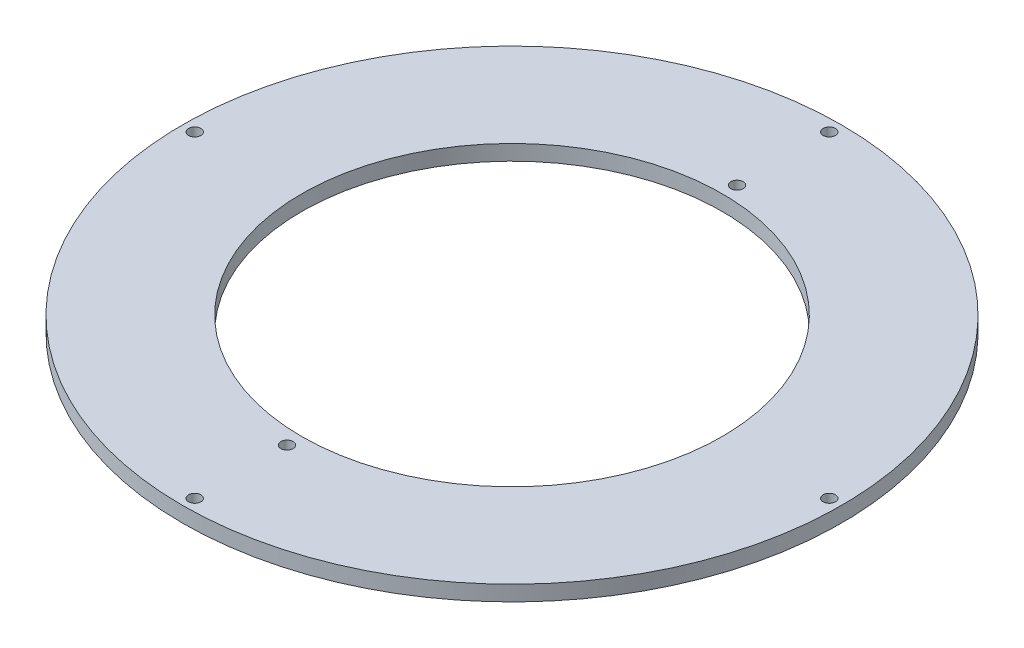
ISO-10303-21;
HEADER;
FILE_DESCRIPTION(('STEP AP214'),'2;1');
FILE_NAME('part.step','',(''),(''),'','','');
FILE_SCHEMA(('AUTOMOTIVE_DESIGN { 1 0 10303 214 1 1 1 1 }'));
ENDSEC;
DATA;
#1=APPLICATION_CONTEXT('core data for automotive mechanical design processes');
#2=APPLICATION_PROTOCOL_DEFINITION('international standard','automotive_design',2000,#1);
#3=PRODUCT_CONTEXT('',#1,'mechanical');
#4=PRODUCT('Part','Part','',(#3));
#5=PRODUCT_RELATED_PRODUCT_CATEGORY('part','',(#4));
#6=PRODUCT_DEFINITION_FORMATION('','',#4);
#7=PRODUCT_DEFINITION_CONTEXT('part definition',#1,'design');
#8=PRODUCT_DEFINITION('design','',#6,#7);
#9=PRODUCT_DEFINITION_SHAPE('','',#8);
#10=(LENGTH_UNIT() NAMED_UNIT(*) SI_UNIT(.MILLI.,.METRE.));
#11=(NAMED_UNIT(*) PLANE_ANGLE_UNIT() SI_UNIT($,.RADIAN.));
#12=(NAMED_UNIT(*) SI_UNIT($,.STERADIAN.) SOLID_ANGLE_UNIT());
#13=UNCERTAINTY_MEASURE_WITH_UNIT(LENGTH_MEASURE(1.E-05),#10,'distance_accuracy_value','');
#14=(GEOMETRIC_REPRESENTATION_CONTEXT(3) GLOBAL_UNCERTAINTY_ASSIGNED_CONTEXT((#13)) GLOBAL_UNIT_ASSIGNED_CONTEXT((#10,
#11,#12)) REPRESENTATION_CONTEXT('',''));
#15=CARTESIAN_POINT('',(0.,0.,0.));
#16=DIRECTION('',(0.,0.,1.));
#17=DIRECTION('',(1.,0.,0.));
#18=AXIS2_PLACEMENT_3D('',#15,#16,#17);
#19=CARTESIAN_POINT('',(2.13761300327242E-12,3.125,3.76258481573311E-12));
#20=DIRECTION('',(0.,1.,0.));
#21=DIRECTION('',(0.,0.,1.));
#22=AXIS2_PLACEMENT_3D('',#19,#20,#21);
#23=PLANE('',#22);
#24=CARTESIAN_POINT('',(0.,3.125,-45.7500000000043));
#25=DIRECTION('',(0.,1.,0.));
#26=DIRECTION('',(0.,0.,1.));
#27=AXIS2_PLACEMENT_3D('',#24,#25,#26);
#28=CIRCLE('',#27,1.25);
#29=CARTESIAN_POINT('',(0.,3.125,-44.5000000000043));
#30=VERTEX_POINT('',#29);
#31=EDGE_CURVE('E106',#30,#30,#28,.T.);
#32=ORIENTED_EDGE('',*,*,#31,.F.);
#33=EDGE_LOOP('',(#32));
#34=FACE_BOUND('',#33,.T.);
#35=CARTESIAN_POINT('',(0.,3.125,45.7500000000043));
#36=DIRECTION('',(0.,1.,0.));
#37=DIRECTION('',(0.,0.,-1.));
#38=AXIS2_PLACEMENT_3D('',#35,#36,#37);
#39=CIRCLE('',#38,1.25);
#40=CARTESIAN_POINT('',(0.,3.125,44.5000000000043));
#41=VERTEX_POINT('',#40);
#42=EDGE_CURVE('E102',#41,#41,#39,.T.);
#43=ORIENTED_EDGE('',*,*,#42,.F.);
#44=EDGE_LOOP('',(#43));
#45=FACE_BOUND('',#44,.T.);
#46=CARTESIAN_POINT('',(64.500000000002,3.125,3.4402109166616E-12));
#47=DIRECTION('',(0.,1.,0.));
#48=DIRECTION('',(0.,0.,1.));
#49=AXIS2_PLACEMENT_3D('',#46,#47,#48);
#50=CIRCLE('',#49,1.25);
#51=CARTESIAN_POINT('',(64.500000000002,3.125,1.25000000000344));
#52=VERTEX_POINT('',#51);
#53=EDGE_CURVE('E91',#52,#52,#50,.T.);
#54=ORIENTED_EDGE('',*,*,#53,.F.);
#55=EDGE_LOOP('',(#54));
#56=FACE_BOUND('',#55,.T.);
#57=CARTESIAN_POINT('',(1.87729606165865E-12,3.125,-64.4999999999961));
#58=DIRECTION('',(0.,1.,0.));
#59=DIRECTION('',(0.,0.,1.));
#60=AXIS2_PLACEMENT_3D('',#57,#58,#59);
#61=CIRCLE('',#60,1.25);
#62=CARTESIAN_POINT('',(1.87729606165865E-12,3.125,-63.2499999999961));
#63=VERTEX_POINT('',#62);
#64=EDGE_CURVE('E87',#63,#63,#61,.T.);
#65=ORIENTED_EDGE('',*,*,#64,.F.);
#66=EDGE_LOOP('',(#65));
#67=FACE_BOUND('',#66,.T.);
#68=CARTESIAN_POINT('',(-64.4999999999976,3.125,4.04419840642128E-12));
#69=DIRECTION('',(0.,1.,0.));
#70=DIRECTION('',(0.,0.,1.));
#71=AXIS2_PLACEMENT_3D('',#68,#69,#70);
#72=CIRCLE('',#71,1.25);
#73=CARTESIAN_POINT('',(-64.4999999999976,3.125,1.25000000000404));
#74=VERTEX_POINT('',#73);
#75=EDGE_CURVE('E79',#74,#74,#72,.T.);
#76=ORIENTED_EDGE('',*,*,#75,.F.);
#77=EDGE_LOOP('',(#76));
#78=FACE_BOUND('',#77,.T.);
#79=CARTESIAN_POINT('',(2.47339041609118E-12,3.125,64.5000000000035));
#80=DIRECTION('',(0.,1.,0.));
#81=DIRECTION('',(0.,0.,1.));
#82=AXIS2_PLACEMENT_3D('',#79,#80,#81);
#83=CIRCLE('',#82,1.25);
#84=CARTESIAN_POINT('',(2.47339041609118E-12,3.125,65.7500000000035));
#85=VERTEX_POINT('',#84);
#86=EDGE_CURVE('E70',#85,#85,#83,.T.);
#87=ORIENTED_EDGE('',*,*,#86,.F.);
#88=EDGE_LOOP('',(#87));
#89=FACE_BOUND('',#88,.T.);
#90=CARTESIAN_POINT('',(2.13761300327242E-12,3.125,3.76258481573311E-12));
#91=DIRECTION('',(0.,1.,0.));
#92=DIRECTION('',(0.,0.,1.));
#93=AXIS2_PLACEMENT_3D('',#90,#91,#92);
#94=CIRCLE('',#93,66.9999999999998);
#95=CARTESIAN_POINT('',(2.13761300327242E-12,3.125,67.0000000000036));
#96=VERTEX_POINT('',#95);
#97=EDGE_CURVE('E10',#96,#96,#94,.T.);
#98=ORIENTED_EDGE('',*,*,#97,.T.);
#99=EDGE_LOOP('',(#98));
#100=FACE_BOUND('',#99,.T.);
#101=CARTESIAN_POINT('',(2.13761300327242E-12,3.125,3.76258481573311E-12));
#102=DIRECTION('',(0.,1.,0.));
#103=DIRECTION('',(0.,0.,1.));
#104=AXIS2_PLACEMENT_3D('',#101,#102,#103);
#105=CIRCLE('',#104,42.75);
#106=CARTESIAN_POINT('',(2.13761300327242E-12,3.125,42.7500000000038));
#107=VERTEX_POINT('',#106);
#108=EDGE_CURVE('E56',#107,#107,#105,.T.);
#109=ORIENTED_EDGE('',*,*,#108,.F.);
#110=EDGE_LOOP('',(#109));
#111=FACE_BOUND('',#110,.T.);
#112=ADVANCED_FACE('F43',(#34,#45,#56,#67,#78,#89,#100,#111),#23,.T.);
#113=CARTESIAN_POINT('',(2.13761300327242E-12,0.,3.76258481573311E-12));
#114=DIRECTION('',(0.,1.,0.));
#115=DIRECTION('',(0.,0.,1.));
#116=AXIS2_PLACEMENT_3D('',#113,#114,#115);
#117=PLANE('',#116);
#118=CARTESIAN_POINT('',(0.,0.,-45.7500000000043));
#119=DIRECTION('',(0.,1.,0.));
#120=DIRECTION('',(0.,0.,1.));
#121=AXIS2_PLACEMENT_3D('',#118,#119,#120);
#122=CIRCLE('',#121,1.25);
#123=CARTESIAN_POINT('',(0.,0.,-44.5000000000043));
#124=VERTEX_POINT('',#123);
#125=EDGE_CURVE('E71',#124,#124,#122,.T.);
#126=ORIENTED_EDGE('',*,*,#125,.T.);
#127=EDGE_LOOP('',(#126));
#128=FACE_BOUND('',#127,.T.);
#129=CARTESIAN_POINT('',(0.,0.,45.7500000000043));
#130=DIRECTION('',(0.,1.,0.));
#131=DIRECTION('',(0.,0.,-1.));
#132=AXIS2_PLACEMENT_3D('',#129,#130,#131);
#133=CIRCLE('',#132,1.25);
#134=CARTESIAN_POINT('',(0.,0.,44.5000000000043));
#135=VERTEX_POINT('',#134);
#136=EDGE_CURVE('E98',#135,#135,#133,.T.);
#137=ORIENTED_EDGE('',*,*,#136,.T.);
#138=EDGE_LOOP('',(#137));
#139=FACE_BOUND('',#138,.T.);
#140=CARTESIAN_POINT('',(64.500000000002,0.,3.4402109166616E-12));
#141=DIRECTION('',(0.,1.,0.));
#142=DIRECTION('',(0.,0.,1.));
#143=AXIS2_PLACEMENT_3D('',#140,#141,#142);
#144=CIRCLE('',#143,1.25);
#145=CARTESIAN_POINT('',(64.500000000002,0.,1.25000000000344));
#146=VERTEX_POINT('',#145);
#147=EDGE_CURVE('E62',#146,#146,#144,.T.);
#148=ORIENTED_EDGE('',*,*,#147,.T.);
#149=EDGE_LOOP('',(#148));
#150=FACE_BOUND('',#149,.T.);
#151=CARTESIAN_POINT('',(1.87729606165865E-12,0.,-64.4999999999961));
#152=DIRECTION('',(0.,1.,0.));
#153=DIRECTION('',(0.,0.,1.));
#154=AXIS2_PLACEMENT_3D('',#151,#152,#153);
#155=CIRCLE('',#154,1.25);
#156=CARTESIAN_POINT('',(1.87729606165865E-12,0.,-63.2499999999961));
#157=VERTEX_POINT('',#156);
#158=EDGE_CURVE('E83',#157,#157,#155,.T.);
#159=ORIENTED_EDGE('',*,*,#158,.T.);
#160=EDGE_LOOP('',(#159));
#161=FACE_BOUND('',#160,.T.);
#162=CARTESIAN_POINT('',(-64.4999999999976,0.,4.04419840642128E-12));
#163=DIRECTION('',(0.,1.,0.));
#164=DIRECTION('',(0.,0.,1.));
#165=AXIS2_PLACEMENT_3D('',#162,#163,#164);
#166=CIRCLE('',#165,1.25);
#167=CARTESIAN_POINT('',(-64.4999999999976,0.,1.25000000000404));
#168=VERTEX_POINT('',#167);
#169=EDGE_CURVE('E75',#168,#168,#166,.T.);
#170=ORIENTED_EDGE('',*,*,#169,.T.);
#171=EDGE_LOOP('',(#170));
#172=FACE_BOUND('',#171,.T.);
#173=CARTESIAN_POINT('',(2.47339041609118E-12,0.,64.5000000000035));
#174=DIRECTION('',(0.,1.,0.));
#175=DIRECTION('',(0.,0.,1.));
#176=AXIS2_PLACEMENT_3D('',#173,#174,#175);
#177=CIRCLE('',#176,1.25);
#178=CARTESIAN_POINT('',(2.47339041609118E-12,0.,65.7500000000035));
#179=VERTEX_POINT('',#178);
#180=EDGE_CURVE('E66',#179,#179,#177,.T.);
#181=ORIENTED_EDGE('',*,*,#180,.T.);
#182=EDGE_LOOP('',(#181));
#183=FACE_BOUND('',#182,.T.);
#184=CARTESIAN_POINT('',(2.13761300327242E-12,0.,3.76258481573311E-12));
#185=DIRECTION('',(0.,1.,0.));
#186=DIRECTION('',(0.,0.,1.));
#187=AXIS2_PLACEMENT_3D('',#184,#185,#186);
#188=CIRCLE('',#187,66.9999999999998);
#189=CARTESIAN_POINT('',(2.13761300327242E-12,0.,67.0000000000036));
#190=VERTEX_POINT('',#189);
#191=EDGE_CURVE('E47',#190,#190,#188,.T.);
#192=ORIENTED_EDGE('',*,*,#191,.F.);
#193=EDGE_LOOP('',(#192));
#194=FACE_BOUND('',#193,.T.);
#195=CARTESIAN_POINT('',(2.13761300327242E-12,0.,3.76258481573311E-12));
#196=DIRECTION('',(0.,1.,0.));
#197=DIRECTION('',(0.,0.,1.));
#198=AXIS2_PLACEMENT_3D('',#195,#196,#197);
#199=CIRCLE('',#198,42.75);
#200=CARTESIAN_POINT('',(2.13761300327242E-12,0.,42.7500000000038));
#201=VERTEX_POINT('',#200);
#202=EDGE_CURVE('E58',#201,#201,#199,.T.);
#203=ORIENTED_EDGE('',*,*,#202,.T.);
#204=EDGE_LOOP('',(#203));
#205=FACE_BOUND('',#204,.T.);
#206=ADVANCED_FACE('F114',(#128,#139,#150,#161,#172,#183,#194,#205),#117,.F.);
#207=CARTESIAN_POINT('',(2.13761300327242E-12,3.125,3.76258481573311E-12));
#208=DIRECTION('',(0.,-1.,0.));
#209=DIRECTION('',(0.,0.,-1.));
#210=AXIS2_PLACEMENT_3D('',#207,#208,#209);
#211=CYLINDRICAL_SURFACE('',#210,66.9999999999998);
#212=ORIENTED_EDGE('',*,*,#97,.F.);
#213=EDGE_LOOP('',(#212));
#214=FACE_BOUND('',#213,.T.);
#215=ORIENTED_EDGE('',*,*,#191,.T.);
#216=EDGE_LOOP('',(#215));
#217=FACE_BOUND('',#216,.T.);
#218=ADVANCED_FACE('F45',(#214,#217),#211,.T.);
#219=CARTESIAN_POINT('',(2.13761300327242E-12,3.125,3.76258481573311E-12));
#220=DIRECTION('',(0.,-1.,0.));
#221=DIRECTION('',(0.,0.,-1.));
#222=AXIS2_PLACEMENT_3D('',#219,#220,#221);
#223=CYLINDRICAL_SURFACE('',#222,42.75);
#224=ORIENTED_EDGE('',*,*,#108,.T.);
#225=EDGE_LOOP('',(#224));
#226=FACE_BOUND('',#225,.T.);
#227=ORIENTED_EDGE('',*,*,#202,.F.);
#228=EDGE_LOOP('',(#227));
#229=FACE_BOUND('',#228,.T.);
#230=ADVANCED_FACE('F139',(#226,#229),#223,.F.);
#231=CARTESIAN_POINT('',(2.47339041609118E-12,0.,64.5000000000035));
#232=DIRECTION('',(0.,1.,0.));
#233=DIRECTION('',(0.,0.,1.));
#234=AXIS2_PLACEMENT_3D('',#231,#232,#233);
#235=CYLINDRICAL_SURFACE('',#234,1.25);
#236=ORIENTED_EDGE('',*,*,#180,.F.);
#237=EDGE_LOOP('',(#236));
#238=FACE_BOUND('',#237,.T.);
#239=ORIENTED_EDGE('',*,*,#86,.T.);
#240=EDGE_LOOP('',(#239));
#241=FACE_BOUND('',#240,.T.);
#242=ADVANCED_FACE('F142',(#238,#241),#235,.F.);
#243=CARTESIAN_POINT('',(-64.4999999999976,0.,4.04419840642128E-12));
#244=DIRECTION('',(0.,1.,0.));
#245=DIRECTION('',(0.,0.,1.));
#246=AXIS2_PLACEMENT_3D('',#243,#244,#245);
#247=CYLINDRICAL_SURFACE('',#246,1.25);
#248=ORIENTED_EDGE('',*,*,#169,.F.);
#249=EDGE_LOOP('',(#248));
#250=FACE_BOUND('',#249,.T.);
#251=ORIENTED_EDGE('',*,*,#75,.T.);
#252=EDGE_LOOP('',(#251));
#253=FACE_BOUND('',#252,.T.);
#254=ADVANCED_FACE('F155',(#250,#253),#247,.F.);
#255=CARTESIAN_POINT('',(1.87729606165865E-12,0.,-64.4999999999961));
#256=DIRECTION('',(0.,1.,0.));
#257=DIRECTION('',(0.,0.,1.));
#258=AXIS2_PLACEMENT_3D('',#255,#256,#257);
#259=CYLINDRICAL_SURFACE('',#258,1.25);
#260=ORIENTED_EDGE('',*,*,#158,.F.);
#261=EDGE_LOOP('',(#260));
#262=FACE_BOUND('',#261,.T.);
#263=ORIENTED_EDGE('',*,*,#64,.T.);
#264=EDGE_LOOP('',(#263));
#265=FACE_BOUND('',#264,.T.);
#266=ADVANCED_FACE('F159',(#262,#265),#259,.F.);
#267=CARTESIAN_POINT('',(64.500000000002,0.,3.4402109166616E-12));
#268=DIRECTION('',(0.,1.,0.));
#269=DIRECTION('',(0.,0.,1.));
#270=AXIS2_PLACEMENT_3D('',#267,#268,#269);
#271=CYLINDRICAL_SURFACE('',#270,1.25);
#272=ORIENTED_EDGE('',*,*,#147,.F.);
#273=EDGE_LOOP('',(#272));
#274=FACE_BOUND('',#273,.T.);
#275=ORIENTED_EDGE('',*,*,#53,.T.);
#276=EDGE_LOOP('',(#275));
#277=FACE_BOUND('',#276,.T.);
#278=ADVANCED_FACE('F163',(#274,#277),#271,.F.);
#279=CARTESIAN_POINT('',(0.,0.,45.7500000000043));
#280=DIRECTION('',(0.,1.,0.));
#281=DIRECTION('',(0.,0.,1.));
#282=AXIS2_PLACEMENT_3D('',#279,#280,#281);
#283=CYLINDRICAL_SURFACE('',#282,1.25);
#284=ORIENTED_EDGE('',*,*,#136,.F.);
#285=EDGE_LOOP('',(#284));
#286=FACE_BOUND('',#285,.T.);
#287=ORIENTED_EDGE('',*,*,#42,.T.);
#288=EDGE_LOOP('',(#287));
#289=FACE_BOUND('',#288,.T.);
#290=ADVANCED_FACE('F120',(#286,#289),#283,.F.);
#291=CARTESIAN_POINT('',(0.,0.,-45.7500000000043));
#292=DIRECTION('',(0.,1.,0.));
#293=DIRECTION('',(0.,0.,1.));
#294=AXIS2_PLACEMENT_3D('',#291,#292,#293);
#295=CYLINDRICAL_SURFACE('',#294,1.25);
#296=ORIENTED_EDGE('',*,*,#125,.F.);
#297=EDGE_LOOP('',(#296));
#298=FACE_BOUND('',#297,.T.);
#299=ORIENTED_EDGE('',*,*,#31,.T.);
#300=EDGE_LOOP('',(#299));
#301=FACE_BOUND('',#300,.T.);
#302=ADVANCED_FACE('F117',(#298,#301),#295,.F.);
#303=CLOSED_SHELL('',(#112,#206,#218,#230,#242,#254,#266,#278,#290,#302));
#304=MANIFOLD_SOLID_BREP('B2',#303);
#305=ADVANCED_BREP_SHAPE_REPRESENTATION('',(#18,#304),#14);
#306=SHAPE_DEFINITION_REPRESENTATION(#9,#305);
ENDSEC;
END-ISO-10303-21;
